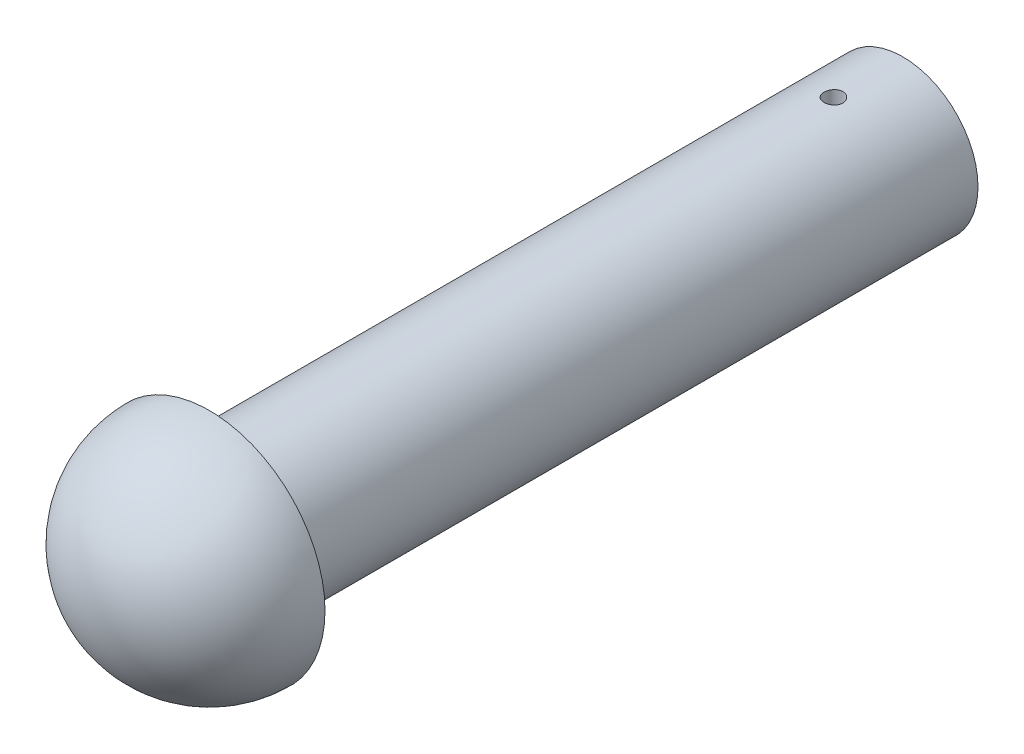
ISO-10303-21;
HEADER;
FILE_DESCRIPTION(('STEP AP214'),'2;1');
FILE_NAME('part.step','',(''),(''),'','','');
FILE_SCHEMA(('AUTOMOTIVE_DESIGN { 1 0 10303 214 1 1 1 1 }'));
ENDSEC;
DATA;
#1=APPLICATION_CONTEXT('core data for automotive mechanical design processes');
#2=APPLICATION_PROTOCOL_DEFINITION('international standard','automotive_design',2000,#1);
#3=PRODUCT_CONTEXT('',#1,'mechanical');
#4=PRODUCT('Part','Part','',(#3));
#5=PRODUCT_RELATED_PRODUCT_CATEGORY('part','',(#4));
#6=PRODUCT_DEFINITION_FORMATION('','',#4);
#7=PRODUCT_DEFINITION_CONTEXT('part definition',#1,'design');
#8=PRODUCT_DEFINITION('design','',#6,#7);
#9=PRODUCT_DEFINITION_SHAPE('','',#8);
#10=(LENGTH_UNIT() NAMED_UNIT(*) SI_UNIT(.MILLI.,.METRE.));
#11=(NAMED_UNIT(*) PLANE_ANGLE_UNIT() SI_UNIT($,.RADIAN.));
#12=(NAMED_UNIT(*) SI_UNIT($,.STERADIAN.) SOLID_ANGLE_UNIT());
#13=UNCERTAINTY_MEASURE_WITH_UNIT(LENGTH_MEASURE(1.E-05),#10,'distance_accuracy_value','');
#14=(GEOMETRIC_REPRESENTATION_CONTEXT(3) GLOBAL_UNCERTAINTY_ASSIGNED_CONTEXT((#13)) GLOBAL_UNIT_ASSIGNED_CONTEXT((#10,
#11,#12)) REPRESENTATION_CONTEXT('',''));
#15=CARTESIAN_POINT('',(0.,0.,0.));
#16=DIRECTION('',(0.,0.,1.));
#17=DIRECTION('',(1.,0.,0.));
#18=AXIS2_PLACEMENT_3D('',#15,#16,#17);
#19=CARTESIAN_POINT('',(0.,0.,90.));
#20=DIRECTION('',(0.,0.,-1.));
#21=DIRECTION('',(-1.,0.,0.));
#22=AXIS2_PLACEMENT_3D('',#19,#20,#21);
#23=CYLINDRICAL_SURFACE('',#22,9.75);
#24=CARTESIAN_POINT('',(0.,0.,90.));
#25=DIRECTION('',(0.,0.,1.));
#26=DIRECTION('',(1.,0.,0.));
#27=AXIS2_PLACEMENT_3D('',#24,#25,#26);
#28=CIRCLE('',#27,9.75);
#29=CARTESIAN_POINT('',(9.75,0.,90.));
#30=VERTEX_POINT('',#29);
#31=EDGE_CURVE('E10',#30,#30,#28,.T.);
#32=ORIENTED_EDGE('',*,*,#31,.F.);
#33=EDGE_LOOP('',(#32));
#34=FACE_BOUND('',#33,.T.);
#35=CARTESIAN_POINT('',(0.,0.,0.));
#36=DIRECTION('',(0.,0.,1.));
#37=DIRECTION('',(1.,0.,0.));
#38=AXIS2_PLACEMENT_3D('',#35,#36,#37);
#39=CIRCLE('',#38,9.75);
#40=CARTESIAN_POINT('',(9.75,0.,0.));
#41=VERTEX_POINT('',#40);
#42=EDGE_CURVE('E50',#41,#41,#39,.T.);
#43=ORIENTED_EDGE('',*,*,#42,.T.);
#44=EDGE_LOOP('',(#43));
#45=FACE_BOUND('',#44,.T.);
#46=CARTESIAN_POINT('',(0.00815064818677974,-9.74999659317552,7.80219569655691));
#47=CARTESIAN_POINT('',(0.0764655628589505,-9.74993852914912,7.80219859911979));
#48=CARTESIAN_POINT('',(0.144822558835157,-9.74915676733158,7.8079472425878));
#49=CARTESIAN_POINT('',(0.279633092168635,-9.74622313218968,7.83078833049596));
#50=CARTESIAN_POINT('',(0.346084565222301,-9.74406982759019,7.84789262593074));
#51=CARTESIAN_POINT('',(0.475112942946028,-9.73863107996317,7.89293262415812));
#52=CARTESIAN_POINT('',(0.537692436734312,-9.73534640332822,7.92086099630947));
#53=CARTESIAN_POINT('',(0.657263949568372,-9.7280058062264,7.9867402726849));
#54=CARTESIAN_POINT('',(0.714256923603282,-9.72395001792711,8.02468945978661));
#55=CARTESIAN_POINT('',(0.82136683404155,-9.7154908123515,8.10975917290462));
#56=CARTESIAN_POINT('',(0.871448175580686,-9.71108576699661,8.15692435866877));
#57=CARTESIAN_POINT('',(0.963006398814097,-9.70243468704467,8.25899138584255));
#58=CARTESIAN_POINT('',(1.00448284229466,-9.69818866055485,8.31389362103079));
#59=CARTESIAN_POINT('',(1.07778377929106,-9.69031736147066,8.43010379640897));
#60=CARTESIAN_POINT('',(1.10957554736603,-9.68669421121093,8.491432534533));
#61=CARTESIAN_POINT('',(1.1623949987164,-9.68049840526261,8.61861198042716));
#62=CARTESIAN_POINT('',(1.18342309870303,-9.67792570890688,8.68446251302581));
#63=CARTESIAN_POINT('',(1.21400903207299,-9.67413669174178,8.81844272121401));
#64=CARTESIAN_POINT('',(1.22362762982047,-9.67291318792306,8.8865583184982));
#65=CARTESIAN_POINT('',(1.2313096234213,-9.67193840346784,9.02344705154207));
#66=CARTESIAN_POINT('',(1.22937349107004,-9.67218706272091,9.09222016034017));
#67=CARTESIAN_POINT('',(1.2140505204556,-9.67412212333558,9.22805133686827));
#68=CARTESIAN_POINT('',(1.20073011803408,-9.67580018287557,9.29511703483957));
#69=CARTESIAN_POINT('',(1.16312040744533,-9.68039290100239,9.42605353503878));
#70=CARTESIAN_POINT('',(1.13883087498696,-9.68330758487501,9.48992427190809));
#71=CARTESIAN_POINT('',(1.0799011178285,-9.69005630284539,9.61286412137025));
#72=CARTESIAN_POINT('',(1.04523203789583,-9.69389289390616,9.67191925647927));
#73=CARTESIAN_POINT('',(0.966548123816672,-9.7020536048898,9.78339845011476));
#74=CARTESIAN_POINT('',(0.922532855444163,-9.70637774746004,9.83582220036496));
#75=CARTESIAN_POINT('',(0.826037113677464,-9.71506666588034,9.93293716519913));
#76=CARTESIAN_POINT('',(0.773499237237481,-9.71943151350443,9.97757135589648));
#77=CARTESIAN_POINT('',(0.661647332222034,-9.72768535059897,10.0573964230687));
#78=CARTESIAN_POINT('',(0.602333284388414,-9.73157433871694,10.0925872727043));
#79=CARTESIAN_POINT('',(0.47856431748163,-9.73844518801099,10.1525291107909));
#80=CARTESIAN_POINT('',(0.414107302962082,-9.74142667702963,10.1772758177942));
#81=CARTESIAN_POINT('',(0.281906895354967,-9.74614793441767,10.2155782523847));
#82=CARTESIAN_POINT('',(0.214163657087952,-9.7478877612237,10.2291345066354));
#83=CARTESIAN_POINT('',(0.0778014139897935,-9.74992638854709,10.2445976079395));
#84=CARTESIAN_POINT('',(0.0091913607174527,-9.75023479993147,10.2465821732461));
#85=CARTESIAN_POINT('',(-0.127384354518894,-9.74940700232297,10.239050051135));
#86=CARTESIAN_POINT('',(-0.195350030569222,-9.74827082498303,10.2295336157204));
#87=CARTESIAN_POINT('',(-0.328472346926148,-9.74469226809194,10.1993349091005));
#88=CARTESIAN_POINT('',(-0.393637730442816,-9.74225433054505,10.1786906073205));
#89=CARTESIAN_POINT('',(-0.519581926968616,-9.7363500819513,10.126861001561));
#90=CARTESIAN_POINT('',(-0.580360592619119,-9.73288373637812,10.095675343676));
#91=CARTESIAN_POINT('',(-0.696146998167606,-9.7252900860965,10.0234637256473));
#92=CARTESIAN_POINT('',(-0.751123734681909,-9.72115950155582,9.98238840479525));
#93=CARTESIAN_POINT('',(-0.853430703068799,-9.71271311969595,9.89163322719569));
#94=CARTESIAN_POINT('',(-0.900760630650124,-9.70839731501488,9.84195302819514));
#95=CARTESIAN_POINT('',(-0.98670569187716,-9.70004082418272,9.73505701576186));
#96=CARTESIAN_POINT('',(-1.02526941798596,-9.69600185327889,9.67779971627616));
#97=CARTESIAN_POINT('',(-1.09223261086752,-9.6886875990395,9.55757629946672));
#98=CARTESIAN_POINT('',(-1.12063227689111,-9.68541230073374,9.49461029408375));
#99=CARTESIAN_POINT('',(-1.1663804963911,-9.68000978501513,9.36491676793255));
#100=CARTESIAN_POINT('',(-1.18375705804462,-9.67787965999599,9.29819925314768));
#101=CARTESIAN_POINT('',(-1.20705553080488,-9.67500165454235,9.16276511879851));
#102=CARTESIAN_POINT('',(-1.21297797032318,-9.67425371034394,9.09404859160286));
#103=CARTESIAN_POINT('',(-1.21319036709342,-9.67422703631878,8.95707177467862));
#104=CARTESIAN_POINT('',(-1.20756003093597,-9.67493823932771,8.88881159680564));
#105=CARTESIAN_POINT('',(-1.18499550151002,-9.67772767604531,8.75421577187083));
#106=CARTESIAN_POINT('',(-1.16806130615629,-9.67980591000617,8.68788012516403));
#107=CARTESIAN_POINT('',(-1.12339467454926,-9.68509092656945,8.55902696926188));
#108=CARTESIAN_POINT('',(-1.09566609551533,-9.68829730600583,8.49650810541476));
#109=CARTESIAN_POINT('',(-1.03020554811699,-9.69547605630771,8.37699777340522));
#110=CARTESIAN_POINT('',(-0.992473456634036,-9.69944843660064,8.32000637328402));
#111=CARTESIAN_POINT('',(-0.907781014556177,-9.70774180198104,8.21276122630246));
#112=CARTESIAN_POINT('',(-0.860761240626811,-9.71206492026506,8.16255456817133));
#113=CARTESIAN_POINT('',(-0.758951805972756,-9.72055018023363,8.07071345362816));
#114=CARTESIAN_POINT('',(-0.704160320514393,-9.72471228382034,8.02908101601714));
#115=CARTESIAN_POINT('',(-0.588128640923313,-9.73241980873859,7.9554385477376));
#116=CARTESIAN_POINT('',(-0.526865175075735,-9.73596287404664,7.92346495554453));
#117=CARTESIAN_POINT('',(-0.399828410254254,-9.74200516772075,7.87030486841261));
#118=CARTESIAN_POINT('',(-0.334060099662511,-9.74450552963211,7.84910665380963));
#119=CARTESIAN_POINT('',(-0.221934604484811,-9.74757859060886,7.82317222463159));
#120=CARTESIAN_POINT('',(-0.176284090725159,-9.7485145387203,7.81531728891282));
#121=CARTESIAN_POINT('',(-0.0843786016026674,-9.74974320295773,7.80482806112456));
#122=CARTESIAN_POINT('',(-0.0381236307114659,-9.75003592383947,7.80219373045617));
#123=CARTESIAN_POINT('',(0.00815064818677974,-9.74999659317552,7.80219569655691));
#124=B_SPLINE_CURVE_WITH_KNOTS('',3,(#46,#47,#48,#49,#50,#51,#52,#53,#54,#55,#56,#57,#58,#59,
#60,#61,#62,#63,#64,#65,#66,#67,#68,#69,#70,#71,#72,#73,#74,#75,#76,#77,#78,#79,#80,#81,#82,#83,
#84,#85,#86,#87,#88,#89,#90,#91,#92,#93,#94,#95,#96,#97,#98,#99,#100,#101,#102,#103,#104,#105,
#106,#107,#108,#109,#110,#111,#112,#113,#114,#115,#116,#117,#118,#119,#120,#121,#122,#123),
.UNSPECIFIED.,.T.,.F.,(4,2,2,2,2,2,2,2,2,2,2,2,2,2,2,2,2,2,2,2,2,2,2,2,2,2,2,2,2,2,2,2,2,2,2,2,
2,2,4),(0.,0.204775773502265,0.409765591905289,0.614616822203075,0.819432972856639,
1.02526742246733,1.23111235184753,1.4376453264158,1.64417030453508,1.8495903682432,
2.05500204442716,2.25922310962436,2.4634483508184,2.66824669676632,2.87305455977433,
3.07930399524045,3.28555401689052,3.4918885062679,3.69821328423887,3.90315072456279,
4.10808367450108,4.31232175797885,4.51656669903228,4.72185299555504,4.92714745907261,
5.13361643660819,5.34008136641408,5.54601957384346,5.7519482805252,5.95646099197226,
6.160973741146,6.36541347758223,6.56985573028356,6.77565105917291,6.98149478733561,
7.18810564260439,7.39449129751704,7.5332007046973,7.67190908631675),.UNSPECIFIED.);
#125=CARTESIAN_POINT('',(0.00815064818677974,-9.74999659317552,7.80219569655691));
#126=VERTEX_POINT('',#125);
#127=EDGE_CURVE('E59',#126,#126,#124,.T.);
#128=ORIENTED_EDGE('',*,*,#127,.F.);
#129=EDGE_LOOP('',(#128));
#130=FACE_BOUND('',#129,.T.);
#131=CARTESIAN_POINT('',(0.00815064818677974,9.74999659317551,7.80219569655691));
#132=CARTESIAN_POINT('',(-0.0601554080855431,9.7500527405098,7.80219859671205));
#133=CARTESIAN_POINT('',(-0.128504697497185,9.74938544970465,7.8079457434028));
#134=CARTESIAN_POINT('',(-0.263302509193431,9.7466779257308,7.83078205875471));
#135=CARTESIAN_POINT('',(-0.329748974970623,9.74463626154163,7.84788304897197));
#136=CARTESIAN_POINT('',(-0.458770099083697,9.73941459218046,7.89291573098225));
#137=CARTESIAN_POINT('',(-0.521347322551972,9.7362353508696,7.92084015609195));
#138=CARTESIAN_POINT('',(-0.640915834560479,9.72909650738461,7.98671117807421));
#139=CARTESIAN_POINT('',(-0.697908076835787,9.72513703879713,8.02465605967179));
#140=CARTESIAN_POINT('',(-0.805013236517117,9.71685945441196,8.10971325092749));
#141=CARTESIAN_POINT('',(-0.855091113705239,9.71253967789491,8.15686952633815));
#142=CARTESIAN_POINT('',(-0.946644479685699,9.70404469877943,8.25891647989879));
#143=CARTESIAN_POINT('',(-0.988119528646269,9.69986950358202,8.31380755326043));
#144=CARTESIAN_POINT('',(-1.06142317961599,9.69212303813354,8.42999750427402));
#145=CARTESIAN_POINT('',(-1.09321832040936,9.6885538812016,8.49131764563333));
#146=CARTESIAN_POINT('',(-1.14604658896203,9.68244745253173,8.61847879928355));
#147=CARTESIAN_POINT('',(-1.16708011962486,9.67991014216326,8.68431964221939));
#148=CARTESIAN_POINT('',(-1.19768269234375,9.67617150738145,8.81829359650281));
#149=CARTESIAN_POINT('',(-1.20731025434735,9.67496336577967,8.88641314697745));
#150=CARTESIAN_POINT('',(-1.21500860624944,9.67399969035931,9.02331098152755));
#151=CARTESIAN_POINT('',(-1.21307985746985,9.67424409855569,9.09208923919833));
#152=CARTESIAN_POINT('',(-1.19776871388538,9.67615148365138,9.22794109556741));
#153=CARTESIAN_POINT('',(-1.18445128933596,9.67780641361055,9.29502214580245));
#154=CARTESIAN_POINT('',(-1.146842175738,9.68233487685693,9.4259898862067));
#155=CARTESIAN_POINT('',(-1.12255026472697,9.68520843479122,9.48987651173862));
#156=CARTESIAN_POINT('',(-1.06361181430266,9.69185778655498,9.61284371675559));
#157=CARTESIAN_POINT('',(-1.02893703977474,9.69563603490999,9.67191062493092));
#158=CARTESIAN_POINT('',(-0.950237184798775,9.7036647100144,9.78341181994357));
#159=CARTESIAN_POINT('',(-0.906211679932421,9.7079151581922,9.83584580554815));
#160=CARTESIAN_POINT('',(-0.809700772487663,9.71644183216698,9.93296880958638));
#161=CARTESIAN_POINT('',(-0.757159509575336,9.72071803519883,9.97760234070558));
#162=CARTESIAN_POINT('',(-0.645300793101553,9.72878337489822,10.0574251510718));
#163=CARTESIAN_POINT('',(-0.585983327305719,9.73257251068634,10.0926144132668));
#164=CARTESIAN_POINT('',(-0.462217529649401,9.7392346720411,10.1525475648234));
#165=CARTESIAN_POINT('',(-0.397767834865317,9.74210745323835,10.177288668485));
#166=CARTESIAN_POINT('',(-0.265585047674233,9.7466062794381,10.215582414956));
#167=CARTESIAN_POINT('',(-0.19785210958763,9.74823238297719,10.2291355830865));
#168=CARTESIAN_POINT('',(-0.0615106327949992,9.75004269937394,10.2445965009715));
#169=CARTESIAN_POINT('',(0.00708902350749124,9.75023648026053,10.2465815080597));
#170=CARTESIAN_POINT('',(0.143642060945472,9.74918095052935,10.2390542726574));
#171=CARTESIAN_POINT('',(0.211595455531322,9.74793167001195,10.2295422699791));
#172=CARTESIAN_POINT('',(0.344704965034346,9.74413158324805,10.1993544921434));
#173=CARTESIAN_POINT('',(0.409869360625382,9.74158496866191,10.1787146583375));
#174=CARTESIAN_POINT('',(0.535811474983959,9.73547044940292,10.126895141918));
#175=CARTESIAN_POINT('',(0.596589041940223,9.73190250940711,10.0957150947603));
#176=CARTESIAN_POINT('',(0.712383352135229,9.72411433405924,10.0235099313029));
#177=CARTESIAN_POINT('',(0.767368147174904,9.71989076974119,9.98243394511576));
#178=CARTESIAN_POINT('',(0.8696905786716,9.71127076864514,9.89167488738886));
#179=CARTESIAN_POINT('',(0.917027909506604,9.70687432496693,9.84199147202752));
#180=CARTESIAN_POINT('',(1.00298641779228,9.69837097377751,9.7350864862441));
#181=CARTESIAN_POINT('',(1.04155626383151,9.69426586354935,9.67782347869435));
#182=CARTESIAN_POINT('',(1.10852991765673,9.68683651524204,9.55758564304824));
#183=CARTESIAN_POINT('',(1.13693393519254,9.68351226105211,9.49461093283407));
#184=CARTESIAN_POINT('',(1.18268404889102,9.67803138586511,9.36490871151163));
#185=CARTESIAN_POINT('',(1.20006003648471,9.67587161096652,9.29819188295975));
#186=CARTESIAN_POINT('',(1.22335756553715,9.67295386077391,9.16275841908939));
#187=CARTESIAN_POINT('',(1.22927964907367,9.67219581914028,9.09404187856733));
#188=CARTESIAN_POINT('',(1.22949128580767,9.67216887695495,8.95707709836586));
#189=CARTESIAN_POINT('',(1.22386255497182,9.67288951551099,8.8888289725914));
#190=CARTESIAN_POINT('',(1.20130540874641,9.67571664502852,8.75425708647322));
#191=CARTESIAN_POINT('',(1.18437699333112,9.67782313599315,8.68793332613386));
#192=CARTESIAN_POINT('',(1.13972662748613,9.68318258071753,8.55910373497369));
#193=CARTESIAN_POINT('',(1.11200862753865,9.68643511482547,8.49659651644927));
#194=CARTESIAN_POINT('',(1.04657405808888,9.6937227998053,8.3771073772726));
#195=CARTESIAN_POINT('',(1.00885735702413,9.69775796097476,8.32012552933639));
#196=CARTESIAN_POINT('',(0.924193228950455,9.70619306571433,8.21288706079093));
#197=CARTESIAN_POINT('',(0.877184931151519,9.7105952977391,8.16267867399651));
#198=CARTESIAN_POINT('',(0.775399226102509,9.71925198937656,8.07083160924336));
#199=CARTESIAN_POINT('',(0.720619985564352,9.72350641382342,8.02919495919062));
#200=CARTESIAN_POINT('',(0.604601633888935,9.73141038605442,7.95553407147865));
#201=CARTESIAN_POINT('',(0.54333810288445,9.73505750380877,7.923548053651));
#202=CARTESIAN_POINT('',(0.416297539986599,9.74131534819051,7.87036387763257));
#203=CARTESIAN_POINT('',(0.350525497172131,9.74392719939325,7.84915400657532));
#204=CARTESIAN_POINT('',(0.238370164003996,9.7471906399098,7.82319696807142));
#205=CARTESIAN_POINT('',(0.192694187789693,9.74820410568043,7.81533286735454));
#206=CARTESIAN_POINT('',(0.100735642701171,9.74958804970621,7.80483126807265));
#207=CARTESIAN_POINT('',(0.0544530783407955,9.7499585327433,7.80219373063708));
#208=CARTESIAN_POINT('',(0.00815064818677974,9.74999659317551,7.80219569655691));
#209=B_SPLINE_CURVE_WITH_KNOTS('',3,(#131,#132,#133,#134,#135,#136,#137,#138,#139,#140,#141,
#142,#143,#144,#145,#146,#147,#148,#149,#150,#151,#152,#153,#154,#155,#156,#157,#158,#159,#160,
#161,#162,#163,#164,#165,#166,#167,#168,#169,#170,#171,#172,#173,#174,#175,#176,#177,#178,#179,
#180,#181,#182,#183,#184,#185,#186,#187,#188,#189,#190,#191,#192,#193,#194,#195,#196,#197,#198,
#199,#200,#201,#202,#203,#204,#205,#206,#207,#208),.UNSPECIFIED.,.T.,.F.,(4,2,2,2,2,2,2,2,2,2,2,
2,2,2,2,2,2,2,2,2,2,2,2,2,2,2,2,2,2,2,2,2,2,2,2,2,2,2,4),(0.,0.204749127565369,
0.409711773759674,0.614537048967098,0.819327285432185,1.0251199791949,1.23092319180837,
1.43742994588684,1.64392896800064,1.84936386485855,2.054790560917,2.25905309490468,
2.46331976035234,2.66814703187601,2.87298360224877,3.07922267276772,3.28546211565548,
3.49175651167442,3.69804122074095,3.9029466755448,4.10784785636806,4.31209116513425,
4.51634153859088,4.72166514232139,4.92699694954231,5.13350161805455,5.34000202554511,
5.54594029683409,5.75186882146442,5.95634553269772,6.16082224439645,6.36522415961272,
6.56962876447362,6.77541970714858,6.98125928014533,7.18790366006156,7.39432294987496,
7.53311668505853,7.67190938801293),.UNSPECIFIED.);
#210=CARTESIAN_POINT('',(0.00815064818677974,9.74999659317551,7.80219569655691));
#211=VERTEX_POINT('',#210);
#212=EDGE_CURVE('E41',#211,#211,#209,.T.);
#213=ORIENTED_EDGE('',*,*,#212,.F.);
#214=EDGE_LOOP('',(#213));
#215=FACE_BOUND('',#214,.T.);
#216=ADVANCED_FACE('F37',(#34,#45,#130,#215),#23,.T.);
#217=CARTESIAN_POINT('',(0.,0.,0.));
#218=DIRECTION('',(0.,0.,1.));
#219=DIRECTION('',(1.,0.,0.));
#220=AXIS2_PLACEMENT_3D('',#217,#218,#219);
#221=PLANE('',#220);
#222=ORIENTED_EDGE('',*,*,#42,.F.);
#223=EDGE_LOOP('',(#222));
#224=FACE_BOUND('',#223,.T.);
#225=ADVANCED_FACE('F76',(#224),#221,.F.);
#226=CARTESIAN_POINT('',(0.,0.,90.));
#227=DIRECTION('',(0.,1.,0.));
#228=DIRECTION('',(-1.,0.,0.));
#229=AXIS2_PLACEMENT_3D('',#226,#227,#228);
#230=SPHERICAL_SURFACE('',#229,15.);
#231=CARTESIAN_POINT('',(0.,0.,90.));
#232=DIRECTION('',(0.,0.,-1.));
#233=DIRECTION('',(-1.,0.,0.));
#234=AXIS2_PLACEMENT_3D('',#231,#232,#233);
#235=SPHERICAL_SURFACE('',#234,15.);
#236=CARTESIAN_POINT('',(0.,0.,90.));
#237=DIRECTION('',(0.,0.,-1.));
#238=DIRECTION('',(-1.,0.,0.));
#239=AXIS2_PLACEMENT_3D('',#236,#237,#238);
#240=CIRCLE('',#239,15.);
#241=CARTESIAN_POINT('',(-15.,0.,89.9999999999999));
#242=VERTEX_POINT('',#241);
#243=EDGE_CURVE('E56',#242,#242,#240,.T.);
#244=ORIENTED_EDGE('',*,*,#243,.F.);
#245=EDGE_LOOP('',(#244));
#246=FACE_BOUND('',#245,.T.);
#247=ADVANCED_FACE('F74',(#246),#235,.T.);
#248=CARTESIAN_POINT('',(0.,0.,90.));
#249=DIRECTION('',(0.,0.,-1.));
#250=DIRECTION('',(-1.,0.,0.));
#251=AXIS2_PLACEMENT_3D('',#248,#249,#250);
#252=PLANE('',#251);
#253=ORIENTED_EDGE('',*,*,#31,.T.);
#254=EDGE_LOOP('',(#253));
#255=FACE_BOUND('',#254,.T.);
#256=ORIENTED_EDGE('',*,*,#243,.T.);
#257=EDGE_LOOP('',(#256));
#258=FACE_BOUND('',#257,.T.);
#259=ADVANCED_FACE('F69',(#255,#258),#252,.T.);
#260=CARTESIAN_POINT('',(0.00815064818677974,22.,9.0234323447353));
#261=DIRECTION('',(0.,-1.,0.));
#262=DIRECTION('',(0.,0.,-1.));
#263=AXIS2_PLACEMENT_3D('',#260,#261,#262);
#264=CYLINDRICAL_SURFACE('',#263,1.22123664817838);
#265=ORIENTED_EDGE('',*,*,#127,.T.);
#266=EDGE_LOOP('',(#265));
#267=FACE_BOUND('',#266,.T.);
#268=ORIENTED_EDGE('',*,*,#212,.T.);
#269=EDGE_LOOP('',(#268));
#270=FACE_BOUND('',#269,.T.);
#271=ADVANCED_FACE('F65',(#267,#270),#264,.F.);
#272=CLOSED_SHELL('',(#216,#225,#247,#259,#271));
#273=MANIFOLD_SOLID_BREP('B2',#272);
#274=ADVANCED_BREP_SHAPE_REPRESENTATION('',(#18,#273),#14);
#275=SHAPE_DEFINITION_REPRESENTATION(#9,#274);
ENDSEC;
END-ISO-10303-21;
